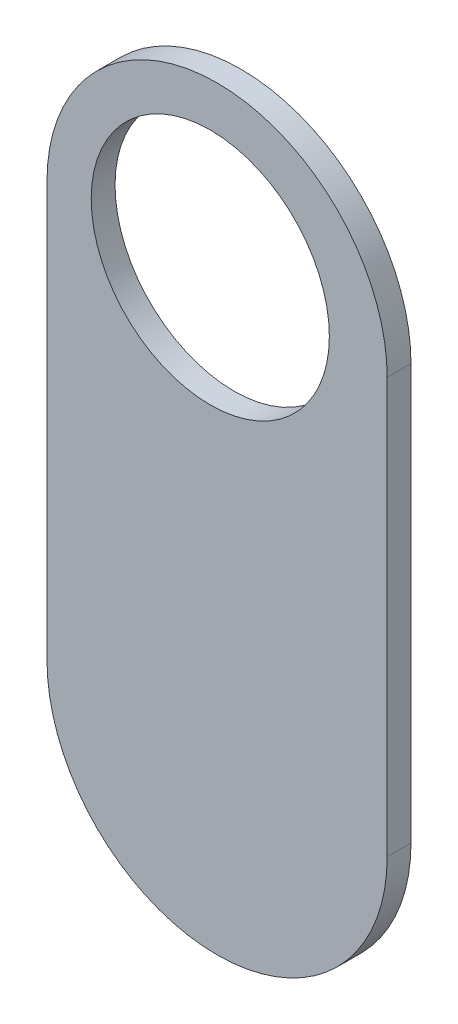
ISO-10303-21;
HEADER;
FILE_DESCRIPTION(('STEP AP214'),'2;1');
FILE_NAME('part.step','',(''),(''),'','','');
FILE_SCHEMA(('AUTOMOTIVE_DESIGN { 1 0 10303 214 1 1 1 1 }'));
ENDSEC;
DATA;
#1=APPLICATION_CONTEXT('core data for automotive mechanical design processes');
#2=APPLICATION_PROTOCOL_DEFINITION('international standard','automotive_design',2000,#1);
#3=PRODUCT_CONTEXT('',#1,'mechanical');
#4=PRODUCT('Part','Part','',(#3));
#5=PRODUCT_RELATED_PRODUCT_CATEGORY('part','',(#4));
#6=PRODUCT_DEFINITION_FORMATION('','',#4);
#7=PRODUCT_DEFINITION_CONTEXT('part definition',#1,'design');
#8=PRODUCT_DEFINITION('design','',#6,#7);
#9=PRODUCT_DEFINITION_SHAPE('','',#8);
#10=(LENGTH_UNIT() NAMED_UNIT(*) SI_UNIT(.MILLI.,.METRE.));
#11=(NAMED_UNIT(*) PLANE_ANGLE_UNIT() SI_UNIT($,.RADIAN.));
#12=(NAMED_UNIT(*) SI_UNIT($,.STERADIAN.) SOLID_ANGLE_UNIT());
#13=UNCERTAINTY_MEASURE_WITH_UNIT(LENGTH_MEASURE(1.E-05),#10,'distance_accuracy_value','');
#14=(GEOMETRIC_REPRESENTATION_CONTEXT(3) GLOBAL_UNCERTAINTY_ASSIGNED_CONTEXT((#13)) GLOBAL_UNIT_ASSIGNED_CONTEXT((#10,
#11,#12)) REPRESENTATION_CONTEXT('',''));
#15=CARTESIAN_POINT('',(0.,0.,0.));
#16=DIRECTION('',(0.,0.,1.));
#17=DIRECTION('',(1.,0.,0.));
#18=AXIS2_PLACEMENT_3D('',#15,#16,#17);
#19=CARTESIAN_POINT('',(107.79,-126.33,-0.045));
#20=DIRECTION('',(0.,0.,-1.));
#21=DIRECTION('',(0.,-1.,0.));
#22=AXIS2_PLACEMENT_3D('',#19,#20,#21);
#23=CYLINDRICAL_SURFACE('',#22,0.175);
#24=CARTESIAN_POINT('',(107.79,-126.33,1.6));
#25=DIRECTION('',(0.,0.,-1.));
#26=DIRECTION('',(0.,-1.,0.));
#27=AXIS2_PLACEMENT_3D('',#24,#25,#26);
#28=CIRCLE('',#27,0.175);
#29=CARTESIAN_POINT('',(107.79,-126.505,1.6));
#30=VERTEX_POINT('',#29);
#31=EDGE_CURVE('E86',#30,#30,#28,.T.);
#32=ORIENTED_EDGE('',*,*,#31,.T.);
#33=DIRECTION('',(0.,0.,1.));
#34=VECTOR('',#33,1.);
#35=CARTESIAN_POINT('',(107.79,-126.505,-0.045));
#36=LINE('',#35,#34);
#37=CARTESIAN_POINT('',(107.79,-126.505,1.635));
#38=VERTEX_POINT('',#37);
#39=EDGE_CURVE('E11',#30,#38,#36,.T.);
#40=ORIENTED_EDGE('',*,*,#39,.T.);
#41=CARTESIAN_POINT('',(107.79,-126.33,1.635));
#42=DIRECTION('',(0.,0.,-1.));
#43=DIRECTION('',(0.,-1.,0.));
#44=AXIS2_PLACEMENT_3D('',#41,#42,#43);
#45=CIRCLE('',#44,0.175);
#46=EDGE_CURVE('E25',#38,#38,#45,.T.);
#47=ORIENTED_EDGE('',*,*,#46,.F.);
#48=ORIENTED_EDGE('',*,*,#39,.F.);
#49=EDGE_LOOP('',(#32,#40,#47,#48));
#50=FACE_BOUND('',#49,.T.);
#51=ADVANCED_FACE('F17',(#50),#23,.F.);
#52=CARTESIAN_POINT('',(107.55,-126.34,1.6));
#53=DIRECTION('',(1.,0.,0.));
#54=DIRECTION('',(0.,1.,0.));
#55=AXIS2_PLACEMENT_3D('',#52,#53,#54);
#56=PLANE('',#55);
#57=DIRECTION('',(0.,-1.,0.));
#58=VECTOR('',#57,1.);
#59=CARTESIAN_POINT('',(107.55,-126.34,1.6));
#60=LINE('',#59,#58);
#61=CARTESIAN_POINT('',(107.55,-126.34,1.6));
#62=VERTEX_POINT('',#61);
#63=CARTESIAN_POINT('',(107.55,-126.95,1.6));
#64=VERTEX_POINT('',#63);
#65=EDGE_CURVE('E75',#62,#64,#60,.T.);
#66=ORIENTED_EDGE('',*,*,#65,.T.);
#67=DIRECTION('',(0.,0.,1.));
#68=VECTOR('',#67,1.);
#69=CARTESIAN_POINT('',(107.55,-126.95,1.6));
#70=LINE('',#69,#68);
#71=CARTESIAN_POINT('',(107.55,-126.95,1.635));
#72=VERTEX_POINT('',#71);
#73=EDGE_CURVE('E78',#64,#72,#70,.T.);
#74=ORIENTED_EDGE('',*,*,#73,.T.);
#75=DIRECTION('',(0.,-1.,0.));
#76=VECTOR('',#75,1.);
#77=CARTESIAN_POINT('',(107.55,-126.34,1.635));
#78=LINE('',#77,#76);
#79=CARTESIAN_POINT('',(107.55,-126.34,1.635));
#80=VERTEX_POINT('',#79);
#81=EDGE_CURVE('E123',#80,#72,#78,.T.);
#82=ORIENTED_EDGE('',*,*,#81,.F.);
#83=DIRECTION('',(0.,0.,1.));
#84=VECTOR('',#83,1.);
#85=CARTESIAN_POINT('',(107.55,-126.34,1.6));
#86=LINE('',#85,#84);
#87=EDGE_CURVE('E81',#62,#80,#86,.T.);
#88=ORIENTED_EDGE('',*,*,#87,.F.);
#89=EDGE_LOOP('',(#66,#74,#82,#88));
#90=FACE_BOUND('',#89,.T.);
#91=ADVANCED_FACE('F77',(#90),#56,.F.);
#92=CARTESIAN_POINT('',(108.05,-126.95,1.635));
#93=DIRECTION('',(0.,0.,1.));
#94=DIRECTION('',(1.,0.,0.));
#95=AXIS2_PLACEMENT_3D('',#92,#93,#94);
#96=PLANE('',#95);
#97=ORIENTED_EDGE('',*,*,#46,.T.);
#98=EDGE_LOOP('',(#97));
#99=FACE_BOUND('',#98,.T.);
#100=DIRECTION('',(0.,1.,0.));
#101=VECTOR('',#100,1.);
#102=CARTESIAN_POINT('',(108.05,-126.95,1.635));
#103=LINE('',#102,#101);
#104=CARTESIAN_POINT('',(108.05,-126.95,1.635));
#105=VERTEX_POINT('',#104);
#106=CARTESIAN_POINT('',(108.05,-126.34,1.635));
#107=VERTEX_POINT('',#106);
#108=EDGE_CURVE('E111',#105,#107,#103,.T.);
#109=ORIENTED_EDGE('',*,*,#108,.T.);
#110=CARTESIAN_POINT('',(107.8,-126.34,1.635));
#111=DIRECTION('',(0.,0.,1.));
#112=DIRECTION('',(1.,0.,0.));
#113=AXIS2_PLACEMENT_3D('',#110,#111,#112);
#114=CIRCLE('',#113,0.25);
#115=EDGE_CURVE('E87',#107,#80,#114,.T.);
#116=ORIENTED_EDGE('',*,*,#115,.T.);
#117=ORIENTED_EDGE('',*,*,#81,.T.);
#118=CARTESIAN_POINT('',(107.8,-126.95,1.635));
#119=DIRECTION('',(0.,0.,1.));
#120=DIRECTION('',(-1.,0.,0.));
#121=AXIS2_PLACEMENT_3D('',#118,#119,#120);
#122=CIRCLE('',#121,0.25);
#123=EDGE_CURVE('E94',#72,#105,#122,.T.);
#124=ORIENTED_EDGE('',*,*,#123,.T.);
#125=EDGE_LOOP('',(#109,#116,#117,#124));
#126=FACE_BOUND('',#125,.T.);
#127=ADVANCED_FACE('F129',(#99,#126),#96,.T.);
#128=CARTESIAN_POINT('',(108.05,-126.95,1.6));
#129=DIRECTION('',(0.,0.,1.));
#130=DIRECTION('',(1.,0.,0.));
#131=AXIS2_PLACEMENT_3D('',#128,#129,#130);
#132=PLANE('',#131);
#133=ORIENTED_EDGE('',*,*,#31,.F.);
#134=EDGE_LOOP('',(#133));
#135=FACE_BOUND('',#134,.T.);
#136=CARTESIAN_POINT('',(107.8,-126.95,1.6));
#137=DIRECTION('',(0.,0.,1.));
#138=DIRECTION('',(-1.,0.,0.));
#139=AXIS2_PLACEMENT_3D('',#136,#137,#138);
#140=CIRCLE('',#139,0.25);
#141=CARTESIAN_POINT('',(108.05,-126.95,1.6));
#142=VERTEX_POINT('',#141);
#143=EDGE_CURVE('E92',#64,#142,#140,.T.);
#144=ORIENTED_EDGE('',*,*,#143,.F.);
#145=ORIENTED_EDGE('',*,*,#65,.F.);
#146=CARTESIAN_POINT('',(107.8,-126.34,1.6));
#147=DIRECTION('',(0.,0.,1.));
#148=DIRECTION('',(1.,0.,0.));
#149=AXIS2_PLACEMENT_3D('',#146,#147,#148);
#150=CIRCLE('',#149,0.25);
#151=CARTESIAN_POINT('',(108.05,-126.34,1.6));
#152=VERTEX_POINT('',#151);
#153=EDGE_CURVE('E96',#152,#62,#150,.T.);
#154=ORIENTED_EDGE('',*,*,#153,.F.);
#155=DIRECTION('',(0.,1.,0.));
#156=VECTOR('',#155,1.);
#157=CARTESIAN_POINT('',(108.05,-126.95,1.6));
#158=LINE('',#157,#156);
#159=EDGE_CURVE('E101',#142,#152,#158,.T.);
#160=ORIENTED_EDGE('',*,*,#159,.F.);
#161=EDGE_LOOP('',(#144,#145,#154,#160));
#162=FACE_BOUND('',#161,.T.);
#163=ADVANCED_FACE('F99',(#135,#162),#132,.F.);
#164=CARTESIAN_POINT('',(107.8,-126.34,1.6));
#165=DIRECTION('',(0.,0.,-1.));
#166=DIRECTION('',(1.,0.,0.));
#167=AXIS2_PLACEMENT_3D('',#164,#165,#166);
#168=CYLINDRICAL_SURFACE('',#167,0.25);
#169=ORIENTED_EDGE('',*,*,#153,.T.);
#170=ORIENTED_EDGE('',*,*,#87,.T.);
#171=ORIENTED_EDGE('',*,*,#115,.F.);
#172=DIRECTION('',(0.,0.,1.));
#173=VECTOR('',#172,1.);
#174=CARTESIAN_POINT('',(108.05,-126.34,1.6));
#175=LINE('',#174,#173);
#176=EDGE_CURVE('E245',#152,#107,#175,.T.);
#177=ORIENTED_EDGE('',*,*,#176,.F.);
#178=EDGE_LOOP('',(#169,#170,#171,#177));
#179=FACE_BOUND('',#178,.T.);
#180=ADVANCED_FACE('F150',(#179),#168,.T.);
#181=CARTESIAN_POINT('',(107.8,-126.95,1.6));
#182=DIRECTION('',(0.,0.,-1.));
#183=DIRECTION('',(-1.,0.,0.));
#184=AXIS2_PLACEMENT_3D('',#181,#182,#183);
#185=CYLINDRICAL_SURFACE('',#184,0.25);
#186=ORIENTED_EDGE('',*,*,#143,.T.);
#187=DIRECTION('',(0.,0.,1.));
#188=VECTOR('',#187,1.);
#189=CARTESIAN_POINT('',(108.05,-126.95,1.6));
#190=LINE('',#189,#188);
#191=EDGE_CURVE('E103',#142,#105,#190,.T.);
#192=ORIENTED_EDGE('',*,*,#191,.T.);
#193=ORIENTED_EDGE('',*,*,#123,.F.);
#194=ORIENTED_EDGE('',*,*,#73,.F.);
#195=EDGE_LOOP('',(#186,#192,#193,#194));
#196=FACE_BOUND('',#195,.T.);
#197=ADVANCED_FACE('F90',(#196),#185,.T.);
#198=CARTESIAN_POINT('',(108.05,-126.95,1.6));
#199=DIRECTION('',(-1.,0.,0.));
#200=DIRECTION('',(0.,0.,1.));
#201=AXIS2_PLACEMENT_3D('',#198,#199,#200);
#202=PLANE('',#201);
#203=ORIENTED_EDGE('',*,*,#159,.T.);
#204=ORIENTED_EDGE('',*,*,#176,.T.);
#205=ORIENTED_EDGE('',*,*,#108,.F.);
#206=ORIENTED_EDGE('',*,*,#191,.F.);
#207=EDGE_LOOP('',(#203,#204,#205,#206));
#208=FACE_BOUND('',#207,.T.);
#209=ADVANCED_FACE('F144',(#208),#202,.F.);
#210=CLOSED_SHELL('',(#51,#91,#127,#163,#180,#197,#209));
#211=MANIFOLD_SOLID_BREP('B1',#210);
#212=ADVANCED_BREP_SHAPE_REPRESENTATION('',(#18,#211),#14);
#213=SHAPE_DEFINITION_REPRESENTATION(#9,#212);
ENDSEC;
END-ISO-10303-21;
